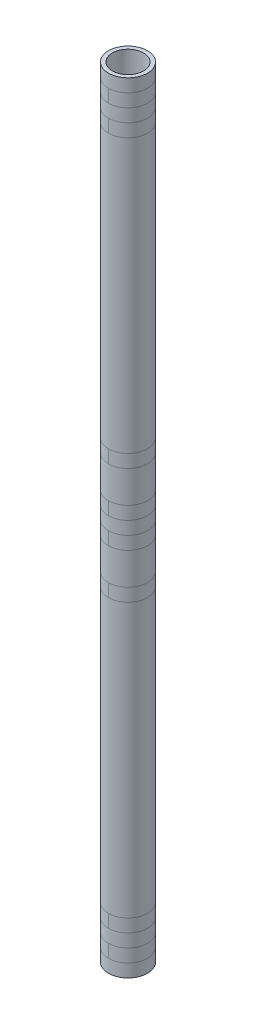
ISO-10303-21;
HEADER;
FILE_DESCRIPTION(('STEP AP214'),'2;1');
FILE_NAME('part.step','',(''),(''),'','','');
FILE_SCHEMA(('AUTOMOTIVE_DESIGN { 1 0 10303 214 1 1 1 1 }'));
ENDSEC;
DATA;
#1=APPLICATION_CONTEXT('core data for automotive mechanical design processes');
#2=APPLICATION_PROTOCOL_DEFINITION('international standard','automotive_design',2000,#1);
#3=PRODUCT_CONTEXT('',#1,'mechanical');
#4=PRODUCT('Part','Part','',(#3));
#5=PRODUCT_RELATED_PRODUCT_CATEGORY('part','',(#4));
#6=PRODUCT_DEFINITION_FORMATION('','',#4);
#7=PRODUCT_DEFINITION_CONTEXT('part definition',#1,'design');
#8=PRODUCT_DEFINITION('design','',#6,#7);
#9=PRODUCT_DEFINITION_SHAPE('','',#8);
#10=(LENGTH_UNIT() NAMED_UNIT(*) SI_UNIT(.MILLI.,.METRE.));
#11=(NAMED_UNIT(*) PLANE_ANGLE_UNIT() SI_UNIT($,.RADIAN.));
#12=(NAMED_UNIT(*) SI_UNIT($,.STERADIAN.) SOLID_ANGLE_UNIT());
#13=UNCERTAINTY_MEASURE_WITH_UNIT(LENGTH_MEASURE(1.E-05),#10,'distance_accuracy_value','');
#14=(GEOMETRIC_REPRESENTATION_CONTEXT(3) GLOBAL_UNCERTAINTY_ASSIGNED_CONTEXT((#13)) GLOBAL_UNIT_ASSIGNED_CONTEXT((#10,
#11,#12)) REPRESENTATION_CONTEXT('',''));
#15=CARTESIAN_POINT('',(0.,0.,0.));
#16=DIRECTION('',(0.,0.,1.));
#17=DIRECTION('',(1.,0.,0.));
#18=AXIS2_PLACEMENT_3D('',#15,#16,#17);
#19=CARTESIAN_POINT('',(0.,600.,0.));
#20=DIRECTION('',(0.,-1.,0.));
#21=DIRECTION('',(0.,0.,-1.));
#22=AXIS2_PLACEMENT_3D('',#19,#20,#21);
#23=CYLINDRICAL_SURFACE('',#22,15.);
#24=DIRECTION('',(0.,-1.,0.));
#25=VECTOR('',#24,1.);
#26=CARTESIAN_POINT('',(0.,600.,-14.9999999999999));
#27=LINE('',#26,#25);
#28=CARTESIAN_POINT('',(0.,260.42,-15.));
#29=VERTEX_POINT('',#28);
#30=CARTESIAN_POINT('',(0.,250.42,-15.));
#31=VERTEX_POINT('',#30);
#32=EDGE_CURVE('E11',#29,#31,#27,.T.);
#33=ORIENTED_EDGE('',*,*,#32,.F.);
#34=CARTESIAN_POINT('',(0.,260.42,0.));
#35=DIRECTION('',(0.,-1.,0.));
#36=DIRECTION('',(0.,0.,-1.));
#37=AXIS2_PLACEMENT_3D('',#34,#35,#36);
#38=CIRCLE('',#37,15.);
#39=CARTESIAN_POINT('',(15.,260.42,0.));
#40=VERTEX_POINT('',#39);
#41=EDGE_CURVE('E322',#29,#40,#38,.T.);
#42=ORIENTED_EDGE('',*,*,#41,.T.);
#43=CARTESIAN_POINT('',(0.,260.42,0.));
#44=DIRECTION('',(0.,-1.,0.));
#45=DIRECTION('',(0.,0.,-1.));
#46=AXIS2_PLACEMENT_3D('',#43,#44,#45);
#47=CIRCLE('',#46,15.);
#48=CARTESIAN_POINT('',(0.,260.42,15.));
#49=VERTEX_POINT('',#48);
#50=EDGE_CURVE('E326',#40,#49,#47,.T.);
#51=ORIENTED_EDGE('',*,*,#50,.T.);
#52=DIRECTION('',(0.,-1.,0.));
#53=VECTOR('',#52,1.);
#54=CARTESIAN_POINT('',(0.,600.,15.));
#55=LINE('',#54,#53);
#56=CARTESIAN_POINT('',(0.,250.42,15.));
#57=VERTEX_POINT('',#56);
#58=EDGE_CURVE('E327',#49,#57,#55,.T.);
#59=ORIENTED_EDGE('',*,*,#58,.T.);
#60=CARTESIAN_POINT('',(0.,250.42,0.));
#61=DIRECTION('',(0.,1.,0.));
#62=DIRECTION('',(0.,0.,1.));
#63=AXIS2_PLACEMENT_3D('',#60,#61,#62);
#64=CIRCLE('',#63,15.);
#65=CARTESIAN_POINT('',(15.,250.42,0.));
#66=VERTEX_POINT('',#65);
#67=EDGE_CURVE('E49',#57,#66,#64,.T.);
#68=ORIENTED_EDGE('',*,*,#67,.T.);
#69=CARTESIAN_POINT('',(0.,250.42,0.));
#70=DIRECTION('',(0.,1.,0.));
#71=DIRECTION('',(0.,0.,1.));
#72=AXIS2_PLACEMENT_3D('',#69,#70,#71);
#73=CIRCLE('',#72,15.);
#74=EDGE_CURVE('E335',#66,#31,#73,.T.);
#75=ORIENTED_EDGE('',*,*,#74,.T.);
#76=EDGE_LOOP('',(#33,#42,#51,#59,#68,#75));
#77=FACE_BOUND('',#76,.T.);
#78=ADVANCED_FACE('F40',(#77),#23,.T.);
#79=CARTESIAN_POINT('',(0.,40.,0.));
#80=DIRECTION('',(0.,-1.,0.));
#81=DIRECTION('',(0.,0.,-1.));
#82=AXIS2_PLACEMENT_3D('',#79,#80,#81);
#83=CIRCLE('',#82,15.);
#84=CARTESIAN_POINT('',(0.,40.,-15.));
#85=VERTEX_POINT('',#84);
#86=CARTESIAN_POINT('',(0.,40.,15.));
#87=VERTEX_POINT('',#86);
#88=EDGE_CURVE('E249',#85,#87,#83,.T.);
#89=ORIENTED_EDGE('',*,*,#88,.F.);
#90=EDGE_CURVE('E254',#87,#85,#83,.T.);
#91=ORIENTED_EDGE('',*,*,#90,.F.);
#92=EDGE_LOOP('',(#89,#91));
#93=FACE_BOUND('',#92,.T.);
#94=ORIENTED_EDGE('',*,*,#67,.F.);
#95=CARTESIAN_POINT('',(-15.,250.42,0.));
#96=VERTEX_POINT('',#95);
#97=EDGE_CURVE('E330',#96,#57,#64,.T.);
#98=ORIENTED_EDGE('',*,*,#97,.F.);
#99=EDGE_CURVE('E333',#31,#96,#73,.T.);
#100=ORIENTED_EDGE('',*,*,#99,.F.);
#101=ORIENTED_EDGE('',*,*,#74,.F.);
#102=EDGE_LOOP('',(#94,#98,#100,#101));
#103=FACE_BOUND('',#102,.T.);
#104=ADVANCED_FACE('F367',(#93,#103),#23,.T.);
#105=CARTESIAN_POINT('',(0.,285.,0.));
#106=DIRECTION('',(0.,1.,0.));
#107=DIRECTION('',(0.,0.,1.));
#108=AXIS2_PLACEMENT_3D('',#105,#106,#107);
#109=CIRCLE('',#108,15.);
#110=CARTESIAN_POINT('',(0.,285.,15.));
#111=VERTEX_POINT('',#110);
#112=CARTESIAN_POINT('',(0.,285.,-15.));
#113=VERTEX_POINT('',#112);
#114=EDGE_CURVE('E265',#111,#113,#109,.T.);
#115=ORIENTED_EDGE('',*,*,#114,.F.);
#116=EDGE_CURVE('E266',#113,#111,#109,.T.);
#117=ORIENTED_EDGE('',*,*,#116,.F.);
#118=EDGE_LOOP('',(#115,#117));
#119=FACE_BOUND('',#118,.T.);
#120=ORIENTED_EDGE('',*,*,#50,.F.);
#121=ORIENTED_EDGE('',*,*,#41,.F.);
#122=CARTESIAN_POINT('',(-15.,260.42,0.));
#123=VERTEX_POINT('',#122);
#124=EDGE_CURVE('E319',#123,#29,#38,.T.);
#125=ORIENTED_EDGE('',*,*,#124,.F.);
#126=EDGE_CURVE('E323',#49,#123,#47,.T.);
#127=ORIENTED_EDGE('',*,*,#126,.F.);
#128=EDGE_LOOP('',(#120,#121,#125,#127));
#129=FACE_BOUND('',#128,.T.);
#130=ADVANCED_FACE('F364',(#119,#129),#23,.T.);
#131=DIRECTION('',(0.,-1.,0.));
#132=VECTOR('',#131,1.);
#133=CARTESIAN_POINT('',(0.,600.,-15.));
#134=LINE('',#133,#132);
#135=CARTESIAN_POINT('',(0.,349.58,-15.));
#136=VERTEX_POINT('',#135);
#137=CARTESIAN_POINT('',(0.,339.58,-15.));
#138=VERTEX_POINT('',#137);
#139=EDGE_CURVE('E316',#136,#138,#134,.T.);
#140=ORIENTED_EDGE('',*,*,#139,.F.);
#141=CARTESIAN_POINT('',(0.,349.58,0.));
#142=DIRECTION('',(0.,-1.,0.));
#143=DIRECTION('',(0.,0.,-1.));
#144=AXIS2_PLACEMENT_3D('',#141,#142,#143);
#145=CIRCLE('',#144,15.);
#146=CARTESIAN_POINT('',(15.,349.58,0.));
#147=VERTEX_POINT('',#146);
#148=EDGE_CURVE('E298',#136,#147,#145,.T.);
#149=ORIENTED_EDGE('',*,*,#148,.T.);
#150=CARTESIAN_POINT('',(0.,349.58,0.));
#151=DIRECTION('',(0.,-1.,0.));
#152=DIRECTION('',(0.,0.,-1.));
#153=AXIS2_PLACEMENT_3D('',#150,#151,#152);
#154=CIRCLE('',#153,15.);
#155=CARTESIAN_POINT('',(0.,349.58,15.));
#156=VERTEX_POINT('',#155);
#157=EDGE_CURVE('E302',#147,#156,#154,.T.);
#158=ORIENTED_EDGE('',*,*,#157,.T.);
#159=DIRECTION('',(0.,-1.,0.));
#160=VECTOR('',#159,1.);
#161=CARTESIAN_POINT('',(0.,600.,15.));
#162=LINE('',#161,#160);
#163=CARTESIAN_POINT('',(0.,339.58,15.));
#164=VERTEX_POINT('',#163);
#165=EDGE_CURVE('E303',#156,#164,#162,.T.);
#166=ORIENTED_EDGE('',*,*,#165,.T.);
#167=CARTESIAN_POINT('',(0.,339.58,0.));
#168=DIRECTION('',(0.,1.,0.));
#169=DIRECTION('',(0.,0.,1.));
#170=AXIS2_PLACEMENT_3D('',#167,#168,#169);
#171=CIRCLE('',#170,15.);
#172=CARTESIAN_POINT('',(15.,339.58,0.));
#173=VERTEX_POINT('',#172);
#174=EDGE_CURVE('E312',#164,#173,#171,.T.);
#175=ORIENTED_EDGE('',*,*,#174,.T.);
#176=CARTESIAN_POINT('',(0.,339.58,0.));
#177=DIRECTION('',(0.,1.,0.));
#178=DIRECTION('',(0.,0.,1.));
#179=AXIS2_PLACEMENT_3D('',#176,#177,#178);
#180=CIRCLE('',#179,15.);
#181=EDGE_CURVE('E315',#173,#138,#180,.T.);
#182=ORIENTED_EDGE('',*,*,#181,.T.);
#183=EDGE_LOOP('',(#140,#149,#158,#166,#175,#182));
#184=FACE_BOUND('',#183,.T.);
#185=ADVANCED_FACE('F374',(#184),#23,.T.);
#186=CARTESIAN_POINT('',(0.,315.,0.));
#187=DIRECTION('',(0.,-1.,0.));
#188=DIRECTION('',(0.,0.,-1.));
#189=AXIS2_PLACEMENT_3D('',#186,#187,#188);
#190=CIRCLE('',#189,15.);
#191=CARTESIAN_POINT('',(0.,315.,-15.));
#192=VERTEX_POINT('',#191);
#193=CARTESIAN_POINT('',(0.,315.,15.));
#194=VERTEX_POINT('',#193);
#195=EDGE_CURVE('E291',#192,#194,#190,.T.);
#196=ORIENTED_EDGE('',*,*,#195,.F.);
#197=EDGE_CURVE('E264',#194,#192,#190,.T.);
#198=ORIENTED_EDGE('',*,*,#197,.F.);
#199=EDGE_LOOP('',(#196,#198));
#200=FACE_BOUND('',#199,.T.);
#201=ORIENTED_EDGE('',*,*,#174,.F.);
#202=CARTESIAN_POINT('',(-15.,339.58,0.));
#203=VERTEX_POINT('',#202);
#204=EDGE_CURVE('E307',#203,#164,#171,.T.);
#205=ORIENTED_EDGE('',*,*,#204,.F.);
#206=EDGE_CURVE('E311',#138,#203,#180,.T.);
#207=ORIENTED_EDGE('',*,*,#206,.F.);
#208=ORIENTED_EDGE('',*,*,#181,.F.);
#209=EDGE_LOOP('',(#201,#205,#207,#208));
#210=FACE_BOUND('',#209,.T.);
#211=ADVANCED_FACE('F410',(#200,#210),#23,.T.);
#212=CARTESIAN_POINT('',(0.,560.,0.));
#213=DIRECTION('',(0.,1.,0.));
#214=DIRECTION('',(0.,0.,1.));
#215=AXIS2_PLACEMENT_3D('',#212,#213,#214);
#216=CIRCLE('',#215,15.);
#217=CARTESIAN_POINT('',(0.,560.,15.));
#218=VERTEX_POINT('',#217);
#219=CARTESIAN_POINT('',(0.,560.,-15.));
#220=VERTEX_POINT('',#219);
#221=EDGE_CURVE('E231',#218,#220,#216,.T.);
#222=ORIENTED_EDGE('',*,*,#221,.F.);
#223=EDGE_CURVE('E232',#220,#218,#216,.T.);
#224=ORIENTED_EDGE('',*,*,#223,.F.);
#225=EDGE_LOOP('',(#222,#224));
#226=FACE_BOUND('',#225,.T.);
#227=ORIENTED_EDGE('',*,*,#157,.F.);
#228=ORIENTED_EDGE('',*,*,#148,.F.);
#229=CARTESIAN_POINT('',(-15.,349.58,0.));
#230=VERTEX_POINT('',#229);
#231=EDGE_CURVE('E281',#230,#136,#145,.T.);
#232=ORIENTED_EDGE('',*,*,#231,.F.);
#233=EDGE_CURVE('E299',#156,#230,#154,.T.);
#234=ORIENTED_EDGE('',*,*,#233,.F.);
#235=EDGE_LOOP('',(#227,#228,#232,#234));
#236=FACE_BOUND('',#235,.T.);
#237=ADVANCED_FACE('F469',(#226,#236),#23,.T.);
#238=DIRECTION('',(0.,-1.,0.));
#239=VECTOR('',#238,1.);
#240=CARTESIAN_POINT('',(0.,600.,15.));
#241=LINE('',#240,#239);
#242=CARTESIAN_POINT('',(0.,305.,15.));
#243=VERTEX_POINT('',#242);
#244=EDGE_CURVE('E278',#194,#243,#241,.T.);
#245=ORIENTED_EDGE('',*,*,#244,.F.);
#246=ORIENTED_EDGE('',*,*,#197,.T.);
#247=DIRECTION('',(0.,-1.,0.));
#248=VECTOR('',#247,1.);
#249=CARTESIAN_POINT('',(0.,600.,-15.));
#250=LINE('',#249,#248);
#251=CARTESIAN_POINT('',(0.,305.,-15.));
#252=VERTEX_POINT('',#251);
#253=EDGE_CURVE('E287',#192,#252,#250,.T.);
#254=ORIENTED_EDGE('',*,*,#253,.T.);
#255=CARTESIAN_POINT('',(0.,305.,0.));
#256=DIRECTION('',(0.,1.,0.));
#257=DIRECTION('',(0.,0.,1.));
#258=AXIS2_PLACEMENT_3D('',#255,#256,#257);
#259=CIRCLE('',#258,15.);
#260=EDGE_CURVE('E283',#252,#243,#259,.T.);
#261=ORIENTED_EDGE('',*,*,#260,.T.);
#262=EDGE_LOOP('',(#245,#246,#254,#261));
#263=FACE_BOUND('',#262,.T.);
#264=ADVANCED_FACE('F413',(#263),#23,.T.);
#265=CARTESIAN_POINT('',(0.,295.,0.));
#266=DIRECTION('',(0.,-1.,0.));
#267=DIRECTION('',(0.,0.,-1.));
#268=AXIS2_PLACEMENT_3D('',#265,#266,#267);
#269=CIRCLE('',#268,15.);
#270=CARTESIAN_POINT('',(0.,295.,-15.));
#271=VERTEX_POINT('',#270);
#272=CARTESIAN_POINT('',(0.,295.,15.));
#273=VERTEX_POINT('',#272);
#274=EDGE_CURVE('E274',#271,#273,#269,.T.);
#275=ORIENTED_EDGE('',*,*,#274,.F.);
#276=EDGE_CURVE('E253',#273,#271,#269,.T.);
#277=ORIENTED_EDGE('',*,*,#276,.F.);
#278=EDGE_LOOP('',(#275,#277));
#279=FACE_BOUND('',#278,.T.);
#280=EDGE_CURVE('E282',#243,#252,#259,.T.);
#281=ORIENTED_EDGE('',*,*,#280,.F.);
#282=ORIENTED_EDGE('',*,*,#260,.F.);
#283=EDGE_LOOP('',(#281,#282));
#284=FACE_BOUND('',#283,.T.);
#285=ADVANCED_FACE('F416',(#279,#284),#23,.T.);
#286=ORIENTED_EDGE('',*,*,#231,.T.);
#287=ORIENTED_EDGE('',*,*,#139,.T.);
#288=ORIENTED_EDGE('',*,*,#206,.T.);
#289=ORIENTED_EDGE('',*,*,#204,.T.);
#290=ORIENTED_EDGE('',*,*,#165,.F.);
#291=ORIENTED_EDGE('',*,*,#233,.T.);
#292=EDGE_LOOP('',(#286,#287,#288,#289,#290,#291));
#293=FACE_BOUND('',#292,.T.);
#294=ADVANCED_FACE('F465',(#293),#23,.T.);
#295=DIRECTION('',(0.,-1.,0.));
#296=VECTOR('',#295,1.);
#297=CARTESIAN_POINT('',(0.,600.,15.));
#298=LINE('',#297,#296);
#299=EDGE_CURVE('E261',#273,#111,#298,.T.);
#300=ORIENTED_EDGE('',*,*,#299,.F.);
#301=ORIENTED_EDGE('',*,*,#276,.T.);
#302=DIRECTION('',(0.,-1.,0.));
#303=VECTOR('',#302,1.);
#304=CARTESIAN_POINT('',(0.,600.,-15.));
#305=LINE('',#304,#303);
#306=EDGE_CURVE('E270',#271,#113,#305,.T.);
#307=ORIENTED_EDGE('',*,*,#306,.T.);
#308=ORIENTED_EDGE('',*,*,#116,.T.);
#309=EDGE_LOOP('',(#300,#301,#307,#308));
#310=FACE_BOUND('',#309,.T.);
#311=ADVANCED_FACE('F403',(#310),#23,.T.);
#312=ORIENTED_EDGE('',*,*,#124,.T.);
#313=ORIENTED_EDGE('',*,*,#32,.T.);
#314=ORIENTED_EDGE('',*,*,#99,.T.);
#315=ORIENTED_EDGE('',*,*,#97,.T.);
#316=ORIENTED_EDGE('',*,*,#58,.F.);
#317=ORIENTED_EDGE('',*,*,#126,.T.);
#318=EDGE_LOOP('',(#312,#313,#314,#315,#316,#317));
#319=FACE_BOUND('',#318,.T.);
#320=ADVANCED_FACE('F365',(#319),#23,.T.);
#321=ORIENTED_EDGE('',*,*,#195,.T.);
#322=ORIENTED_EDGE('',*,*,#244,.T.);
#323=ORIENTED_EDGE('',*,*,#280,.T.);
#324=ORIENTED_EDGE('',*,*,#253,.F.);
#325=EDGE_LOOP('',(#321,#322,#323,#324));
#326=FACE_BOUND('',#325,.T.);
#327=ADVANCED_FACE('F395',(#326),#23,.T.);
#328=DIRECTION('',(0.,-1.,0.));
#329=VECTOR('',#328,1.);
#330=CARTESIAN_POINT('',(0.,600.,-15.));
#331=LINE('',#330,#329);
#332=CARTESIAN_POINT('',(0.,30.,-15.));
#333=VERTEX_POINT('',#332);
#334=EDGE_CURVE('E250',#85,#333,#331,.T.);
#335=ORIENTED_EDGE('',*,*,#334,.F.);
#336=ORIENTED_EDGE('',*,*,#88,.T.);
#337=DIRECTION('',(0.,-1.,0.));
#338=VECTOR('',#337,1.);
#339=CARTESIAN_POINT('',(0.,600.,15.));
#340=LINE('',#339,#338);
#341=CARTESIAN_POINT('',(0.,30.,15.));
#342=VERTEX_POINT('',#341);
#343=EDGE_CURVE('E230',#87,#342,#340,.T.);
#344=ORIENTED_EDGE('',*,*,#343,.T.);
#345=CARTESIAN_POINT('',(0.,30.,0.));
#346=DIRECTION('',(0.,1.,0.));
#347=DIRECTION('',(0.,0.,1.));
#348=AXIS2_PLACEMENT_3D('',#345,#346,#347);
#349=CIRCLE('',#348,15.);
#350=EDGE_CURVE('E248',#342,#333,#349,.T.);
#351=ORIENTED_EDGE('',*,*,#350,.T.);
#352=EDGE_LOOP('',(#335,#336,#344,#351));
#353=FACE_BOUND('',#352,.T.);
#354=ADVANCED_FACE('F385',(#353),#23,.T.);
#355=CARTESIAN_POINT('',(0.,20.,0.));
#356=DIRECTION('',(0.,-1.,0.));
#357=DIRECTION('',(0.,0.,-1.));
#358=AXIS2_PLACEMENT_3D('',#355,#356,#357);
#359=CIRCLE('',#358,15.);
#360=CARTESIAN_POINT('',(0.,20.,-15.));
#361=VERTEX_POINT('',#360);
#362=CARTESIAN_POINT('',(0.,20.,15.));
#363=VERTEX_POINT('',#362);
#364=EDGE_CURVE('E190',#361,#363,#359,.T.);
#365=ORIENTED_EDGE('',*,*,#364,.F.);
#366=EDGE_CURVE('E180',#363,#361,#359,.T.);
#367=ORIENTED_EDGE('',*,*,#366,.F.);
#368=EDGE_LOOP('',(#365,#367));
#369=FACE_BOUND('',#368,.T.);
#370=ORIENTED_EDGE('',*,*,#350,.F.);
#371=EDGE_CURVE('E244',#333,#342,#349,.T.);
#372=ORIENTED_EDGE('',*,*,#371,.F.);
#373=EDGE_LOOP('',(#370,#372));
#374=FACE_BOUND('',#373,.T.);
#375=ADVANCED_FACE('F195',(#369,#374),#23,.T.);
#376=ORIENTED_EDGE('',*,*,#274,.T.);
#377=ORIENTED_EDGE('',*,*,#299,.T.);
#378=ORIENTED_EDGE('',*,*,#114,.T.);
#379=ORIENTED_EDGE('',*,*,#306,.F.);
#380=EDGE_LOOP('',(#376,#377,#378,#379));
#381=FACE_BOUND('',#380,.T.);
#382=ADVANCED_FACE('F388',(#381),#23,.T.);
#383=DIRECTION('',(0.,-1.,0.));
#384=VECTOR('',#383,1.);
#385=CARTESIAN_POINT('',(0.,600.,15.));
#386=LINE('',#385,#384);
#387=CARTESIAN_POINT('',(0.,570.,15.));
#388=VERTEX_POINT('',#387);
#389=EDGE_CURVE('E227',#388,#218,#386,.T.);
#390=ORIENTED_EDGE('',*,*,#389,.F.);
#391=CARTESIAN_POINT('',(0.,570.,0.));
#392=DIRECTION('',(0.,-1.,0.));
#393=DIRECTION('',(0.,0.,-1.));
#394=AXIS2_PLACEMENT_3D('',#391,#392,#393);
#395=CIRCLE('',#394,15.);
#396=CARTESIAN_POINT('',(0.,570.,-15.));
#397=VERTEX_POINT('',#396);
#398=EDGE_CURVE('E226',#388,#397,#395,.T.);
#399=ORIENTED_EDGE('',*,*,#398,.T.);
#400=DIRECTION('',(0.,-1.,0.));
#401=VECTOR('',#400,1.);
#402=CARTESIAN_POINT('',(0.,600.,-15.));
#403=LINE('',#402,#401);
#404=EDGE_CURVE('E236',#397,#220,#403,.T.);
#405=ORIENTED_EDGE('',*,*,#404,.T.);
#406=ORIENTED_EDGE('',*,*,#223,.T.);
#407=EDGE_LOOP('',(#390,#399,#405,#406));
#408=FACE_BOUND('',#407,.T.);
#409=ADVANCED_FACE('F393',(#408),#23,.T.);
#410=ORIENTED_EDGE('',*,*,#90,.T.);
#411=ORIENTED_EDGE('',*,*,#334,.T.);
#412=ORIENTED_EDGE('',*,*,#371,.T.);
#413=ORIENTED_EDGE('',*,*,#343,.F.);
#414=EDGE_LOOP('',(#410,#411,#412,#413));
#415=FACE_BOUND('',#414,.T.);
#416=ADVANCED_FACE('F382',(#415),#23,.T.);
#417=CARTESIAN_POINT('',(0.,580.,0.));
#418=DIRECTION('',(0.,1.,0.));
#419=DIRECTION('',(0.,0.,1.));
#420=AXIS2_PLACEMENT_3D('',#417,#418,#419);
#421=CIRCLE('',#420,15.);
#422=CARTESIAN_POINT('',(0.,580.,15.));
#423=VERTEX_POINT('',#422);
#424=CARTESIAN_POINT('',(0.,580.,-15.));
#425=VERTEX_POINT('',#424);
#426=EDGE_CURVE('E222',#423,#425,#421,.T.);
#427=ORIENTED_EDGE('',*,*,#426,.F.);
#428=EDGE_CURVE('E218',#425,#423,#421,.T.);
#429=ORIENTED_EDGE('',*,*,#428,.F.);
#430=EDGE_LOOP('',(#427,#429));
#431=FACE_BOUND('',#430,.T.);
#432=EDGE_CURVE('E240',#397,#388,#395,.T.);
#433=ORIENTED_EDGE('',*,*,#432,.F.);
#434=ORIENTED_EDGE('',*,*,#398,.F.);
#435=EDGE_LOOP('',(#433,#434));
#436=FACE_BOUND('',#435,.T.);
#437=ADVANCED_FACE('F486',(#431,#436),#23,.T.);
#438=DIRECTION('',(0.,-1.,0.));
#439=VECTOR('',#438,1.);
#440=CARTESIAN_POINT('',(0.,600.,15.));
#441=LINE('',#440,#439);
#442=CARTESIAN_POINT('',(0.,590.,15.));
#443=VERTEX_POINT('',#442);
#444=EDGE_CURVE('E223',#443,#423,#441,.T.);
#445=ORIENTED_EDGE('',*,*,#444,.F.);
#446=CARTESIAN_POINT('',(0.,590.,0.));
#447=DIRECTION('',(0.,-1.,0.));
#448=DIRECTION('',(0.,0.,-1.));
#449=AXIS2_PLACEMENT_3D('',#446,#447,#448);
#450=CIRCLE('',#449,15.);
#451=CARTESIAN_POINT('',(0.,590.,-15.));
#452=VERTEX_POINT('',#451);
#453=EDGE_CURVE('E186',#443,#452,#450,.T.);
#454=ORIENTED_EDGE('',*,*,#453,.T.);
#455=DIRECTION('',(0.,-1.,0.));
#456=VECTOR('',#455,1.);
#457=CARTESIAN_POINT('',(0.,600.,-15.));
#458=LINE('',#457,#456);
#459=EDGE_CURVE('E214',#452,#425,#458,.T.);
#460=ORIENTED_EDGE('',*,*,#459,.T.);
#461=ORIENTED_EDGE('',*,*,#428,.T.);
#462=EDGE_LOOP('',(#445,#454,#460,#461));
#463=FACE_BOUND('',#462,.T.);
#464=ADVANCED_FACE('F642',(#463),#23,.T.);
#465=ORIENTED_EDGE('',*,*,#432,.T.);
#466=ORIENTED_EDGE('',*,*,#389,.T.);
#467=ORIENTED_EDGE('',*,*,#221,.T.);
#468=ORIENTED_EDGE('',*,*,#404,.F.);
#469=EDGE_LOOP('',(#465,#466,#467,#468));
#470=FACE_BOUND('',#469,.T.);
#471=ADVANCED_FACE('F484',(#470),#23,.T.);
#472=CARTESIAN_POINT('',(0.,600.,0.));
#473=DIRECTION('',(0.,1.,0.));
#474=DIRECTION('',(0.,0.,1.));
#475=AXIS2_PLACEMENT_3D('',#472,#473,#474);
#476=CIRCLE('',#475,15.);
#477=CARTESIAN_POINT('',(0.,600.,15.));
#478=VERTEX_POINT('',#477);
#479=EDGE_CURVE('E198',#478,#478,#476,.T.);
#480=ORIENTED_EDGE('',*,*,#479,.F.);
#481=EDGE_LOOP('',(#480));
#482=FACE_BOUND('',#481,.T.);
#483=EDGE_CURVE('E213',#452,#443,#450,.T.);
#484=ORIENTED_EDGE('',*,*,#483,.F.);
#485=ORIENTED_EDGE('',*,*,#453,.F.);
#486=EDGE_LOOP('',(#484,#485));
#487=FACE_BOUND('',#486,.T.);
#488=ADVANCED_FACE('F625',(#482,#487),#23,.T.);
#489=DIRECTION('',(0.,-1.,0.));
#490=VECTOR('',#489,1.);
#491=CARTESIAN_POINT('',(0.,600.,15.));
#492=LINE('',#491,#490);
#493=CARTESIAN_POINT('',(0.,10.,15.));
#494=VERTEX_POINT('',#493);
#495=EDGE_CURVE('E175',#363,#494,#492,.T.);
#496=ORIENTED_EDGE('',*,*,#495,.F.);
#497=ORIENTED_EDGE('',*,*,#366,.T.);
#498=DIRECTION('',(0.,-1.,0.));
#499=VECTOR('',#498,1.);
#500=CARTESIAN_POINT('',(0.,600.,-15.));
#501=LINE('',#500,#499);
#502=CARTESIAN_POINT('',(0.,10.,-15.));
#503=VERTEX_POINT('',#502);
#504=EDGE_CURVE('E191',#361,#503,#501,.T.);
#505=ORIENTED_EDGE('',*,*,#504,.T.);
#506=CARTESIAN_POINT('',(0.,10.,0.));
#507=DIRECTION('',(0.,1.,0.));
#508=DIRECTION('',(0.,0.,1.));
#509=AXIS2_PLACEMENT_3D('',#506,#507,#508);
#510=CIRCLE('',#509,15.);
#511=EDGE_CURVE('E182',#503,#494,#510,.T.);
#512=ORIENTED_EDGE('',*,*,#511,.T.);
#513=EDGE_LOOP('',(#496,#497,#505,#512));
#514=FACE_BOUND('',#513,.T.);
#515=ADVANCED_FACE('F177',(#514),#23,.T.);
#516=CARTESIAN_POINT('',(0.,0.,0.));
#517=DIRECTION('',(0.,1.,0.));
#518=DIRECTION('',(0.,0.,1.));
#519=AXIS2_PLACEMENT_3D('',#516,#517,#518);
#520=CIRCLE('',#519,15.);
#521=CARTESIAN_POINT('',(0.,0.,15.));
#522=VERTEX_POINT('',#521);
#523=EDGE_CURVE('E203',#522,#522,#520,.T.);
#524=ORIENTED_EDGE('',*,*,#523,.T.);
#525=EDGE_LOOP('',(#524));
#526=FACE_BOUND('',#525,.T.);
#527=EDGE_CURVE('E187',#494,#503,#510,.T.);
#528=ORIENTED_EDGE('',*,*,#527,.F.);
#529=ORIENTED_EDGE('',*,*,#511,.F.);
#530=EDGE_LOOP('',(#528,#529));
#531=FACE_BOUND('',#530,.T.);
#532=ADVANCED_FACE('F608',(#526,#531),#23,.T.);
#533=ORIENTED_EDGE('',*,*,#483,.T.);
#534=ORIENTED_EDGE('',*,*,#444,.T.);
#535=ORIENTED_EDGE('',*,*,#426,.T.);
#536=ORIENTED_EDGE('',*,*,#459,.F.);
#537=EDGE_LOOP('',(#533,#534,#535,#536));
#538=FACE_BOUND('',#537,.T.);
#539=ADVANCED_FACE('F599',(#538),#23,.T.);
#540=ORIENTED_EDGE('',*,*,#364,.T.);
#541=ORIENTED_EDGE('',*,*,#495,.T.);
#542=ORIENTED_EDGE('',*,*,#527,.T.);
#543=ORIENTED_EDGE('',*,*,#504,.F.);
#544=EDGE_LOOP('',(#540,#541,#542,#543));
#545=FACE_BOUND('',#544,.T.);
#546=ADVANCED_FACE('F42',(#545),#23,.T.);
#547=CARTESIAN_POINT('',(0.,600.,0.));
#548=DIRECTION('',(0.,1.,0.));
#549=DIRECTION('',(0.,0.,1.));
#550=AXIS2_PLACEMENT_3D('',#547,#548,#549);
#551=PLANE('',#550);
#552=CARTESIAN_POINT('',(0.,600.,0.));
#553=DIRECTION('',(0.,1.,0.));
#554=DIRECTION('',(0.,0.,1.));
#555=AXIS2_PLACEMENT_3D('',#552,#553,#554);
#556=CIRCLE('',#555,12.);
#557=CARTESIAN_POINT('',(0.,600.,12.));
#558=VERTEX_POINT('',#557);
#559=EDGE_CURVE('E743',#558,#558,#556,.T.);
#560=ORIENTED_EDGE('',*,*,#559,.F.);
#561=EDGE_LOOP('',(#560));
#562=FACE_BOUND('',#561,.T.);
#563=ORIENTED_EDGE('',*,*,#479,.T.);
#564=EDGE_LOOP('',(#563));
#565=FACE_BOUND('',#564,.T.);
#566=ADVANCED_FACE('F598',(#562,#565),#551,.T.);
#567=CARTESIAN_POINT('',(0.,0.,0.));
#568=DIRECTION('',(0.,1.,0.));
#569=DIRECTION('',(0.,0.,1.));
#570=AXIS2_PLACEMENT_3D('',#567,#568,#569);
#571=PLANE('',#570);
#572=CARTESIAN_POINT('',(0.,0.,0.));
#573=DIRECTION('',(0.,1.,0.));
#574=DIRECTION('',(0.,0.,1.));
#575=AXIS2_PLACEMENT_3D('',#572,#573,#574);
#576=CIRCLE('',#575,12.);
#577=CARTESIAN_POINT('',(0.,0.,12.));
#578=VERTEX_POINT('',#577);
#579=EDGE_CURVE('E774',#578,#578,#576,.T.);
#580=ORIENTED_EDGE('',*,*,#579,.T.);
#581=EDGE_LOOP('',(#580));
#582=FACE_BOUND('',#581,.T.);
#583=ORIENTED_EDGE('',*,*,#523,.F.);
#584=EDGE_LOOP('',(#583));
#585=FACE_BOUND('',#584,.T.);
#586=ADVANCED_FACE('F719',(#582,#585),#571,.F.);
#587=CARTESIAN_POINT('',(0.,0.,0.));
#588=DIRECTION('',(0.,1.,0.));
#589=DIRECTION('',(0.,0.,1.));
#590=AXIS2_PLACEMENT_3D('',#587,#588,#589);
#591=CYLINDRICAL_SURFACE('',#590,12.);
#592=ORIENTED_EDGE('',*,*,#579,.F.);
#593=EDGE_LOOP('',(#592));
#594=FACE_BOUND('',#593,.T.);
#595=ORIENTED_EDGE('',*,*,#559,.T.);
#596=EDGE_LOOP('',(#595));
#597=FACE_BOUND('',#596,.T.);
#598=ADVANCED_FACE('F715',(#594,#597),#591,.F.);
#599=CLOSED_SHELL('',(#78,#104,#130,#185,#211,#237,#264,#285,#294,#311,#320,#327,#354,#375,#382,
#409,#416,#437,#464,#471,#488,#515,#532,#539,#546,#566,#586,#598));
#600=MANIFOLD_SOLID_BREP('B2',#599);
#601=ADVANCED_BREP_SHAPE_REPRESENTATION('',(#18,#600),#14);
#602=SHAPE_DEFINITION_REPRESENTATION(#9,#601);
ENDSEC;
END-ISO-10303-21;
